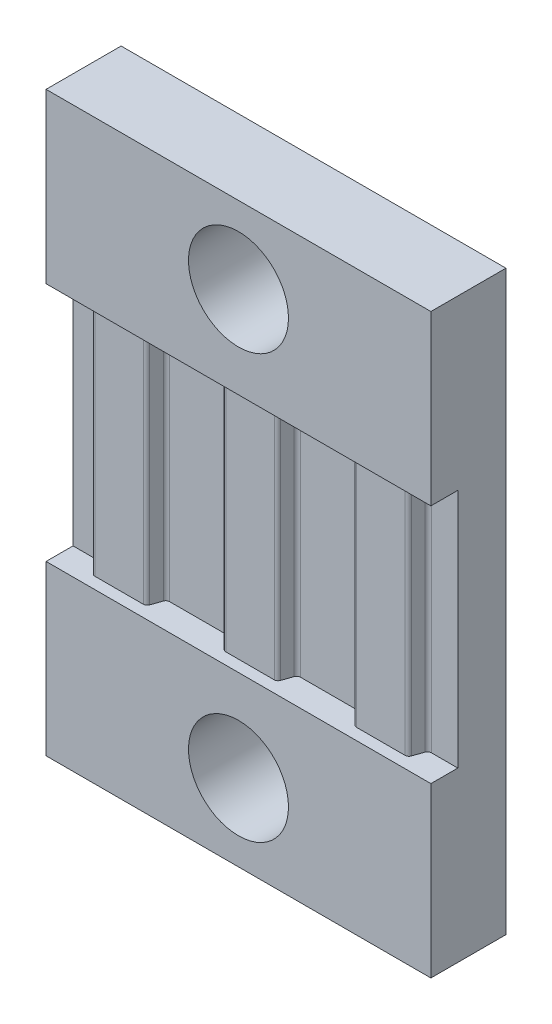
ISO-10303-21;
HEADER;
FILE_DESCRIPTION(('STEP AP214'),'2;1');
FILE_NAME('part.step','',(''),(''),'','','');
FILE_SCHEMA(('AUTOMOTIVE_DESIGN { 1 0 10303 214 1 1 1 1 }'));
ENDSEC;
DATA;
#1=APPLICATION_CONTEXT('core data for automotive mechanical design processes');
#2=APPLICATION_PROTOCOL_DEFINITION('international standard','automotive_design',2000,#1);
#3=PRODUCT_CONTEXT('',#1,'mechanical');
#4=PRODUCT('Part','Part','',(#3));
#5=PRODUCT_RELATED_PRODUCT_CATEGORY('part','',(#4));
#6=PRODUCT_DEFINITION_FORMATION('','',#4);
#7=PRODUCT_DEFINITION_CONTEXT('part definition',#1,'design');
#8=PRODUCT_DEFINITION('design','',#6,#7);
#9=PRODUCT_DEFINITION_SHAPE('','',#8);
#10=(LENGTH_UNIT() NAMED_UNIT(*) SI_UNIT(.MILLI.,.METRE.));
#11=(NAMED_UNIT(*) PLANE_ANGLE_UNIT() SI_UNIT($,.RADIAN.));
#12=(NAMED_UNIT(*) SI_UNIT($,.STERADIAN.) SOLID_ANGLE_UNIT());
#13=UNCERTAINTY_MEASURE_WITH_UNIT(LENGTH_MEASURE(1.E-05),#10,'distance_accuracy_value','');
#14=(GEOMETRIC_REPRESENTATION_CONTEXT(3) GLOBAL_UNCERTAINTY_ASSIGNED_CONTEXT((#13)) GLOBAL_UNIT_ASSIGNED_CONTEXT((#10,
#11,#12)) REPRESENTATION_CONTEXT('',''));
#15=CARTESIAN_POINT('',(0.,0.,0.));
#16=DIRECTION('',(0.,0.,1.));
#17=DIRECTION('',(1.,0.,0.));
#18=AXIS2_PLACEMENT_3D('',#15,#16,#17);
#19=CARTESIAN_POINT('',(0.,0.,1.5875));
#20=DIRECTION('',(0.,0.,-1.));
#21=DIRECTION('',(-1.,0.,0.));
#22=AXIS2_PLACEMENT_3D('',#19,#20,#21);
#23=PLANE('',#22);
#24=DIRECTION('',(0.,1.,0.));
#25=VECTOR('',#24,1.);
#26=CARTESIAN_POINT('',(5.4737,-9.527,1.5875));
#27=LINE('',#26,#25);
#28=CARTESIAN_POINT('',(5.4737,-3.96875,1.5875));
#29=VERTEX_POINT('',#28);
#30=CARTESIAN_POINT('',(5.4737,3.96875,1.5875));
#31=VERTEX_POINT('',#30);
#32=EDGE_CURVE('E338',#29,#31,#27,.T.);
#33=ORIENTED_EDGE('',*,*,#32,.F.);
#34=DIRECTION('',(-1.,0.,0.));
#35=VECTOR('',#34,1.);
#36=CARTESIAN_POINT('',(-6.35,-3.96875,1.5875));
#37=LINE('',#36,#35);
#38=CARTESIAN_POINT('',(6.35,-3.96875,1.5875));
#39=VERTEX_POINT('',#38);
#40=EDGE_CURVE('E446',#39,#29,#37,.T.);
#41=ORIENTED_EDGE('',*,*,#40,.F.);
#42=DIRECTION('',(0.,1.,0.));
#43=VECTOR('',#42,1.);
#44=CARTESIAN_POINT('',(6.35,-9.525,1.5875));
#45=LINE('',#44,#43);
#46=CARTESIAN_POINT('',(6.35,3.96875,1.5875));
#47=VERTEX_POINT('',#46);
#48=EDGE_CURVE('E469',#39,#47,#45,.T.);
#49=ORIENTED_EDGE('',*,*,#48,.T.);
#50=DIRECTION('',(1.,0.,0.));
#51=VECTOR('',#50,1.);
#52=CARTESIAN_POINT('',(-6.35,3.96875,1.5875));
#53=LINE('',#52,#51);
#54=EDGE_CURVE('E263',#31,#47,#53,.T.);
#55=ORIENTED_EDGE('',*,*,#54,.F.);
#56=EDGE_LOOP('',(#33,#41,#49,#55));
#57=FACE_BOUND('',#56,.T.);
#58=ADVANCED_FACE('F43',(#57),#23,.F.);
#59=CARTESIAN_POINT('',(-6.35,-3.96875,2.4765));
#60=DIRECTION('',(0.,-1.,0.));
#61=DIRECTION('',(0.,0.,-1.));
#62=AXIS2_PLACEMENT_3D('',#59,#60,#61);
#63=PLANE('',#62);
#64=CARTESIAN_POINT('',(-5.4737,-3.96875,1.7145));
#65=DIRECTION('',(0.,-1.,0.));
#66=DIRECTION('',(0.,0.,-1.));
#67=AXIS2_PLACEMENT_3D('',#64,#65,#66);
#68=CIRCLE('',#67,0.127);
#69=CARTESIAN_POINT('',(-5.35356486486486,-3.96875,1.67331081081081));
#70=VERTEX_POINT('',#69);
#71=CARTESIAN_POINT('',(-5.4737,-3.96875,1.5875));
#72=VERTEX_POINT('',#71);
#73=EDGE_CURVE('E296',#70,#72,#68,.F.);
#74=ORIENTED_EDGE('',*,*,#73,.T.);
#75=CARTESIAN_POINT('',(-6.35,-3.96875,1.5875));
#76=VERTEX_POINT('',#75);
#77=EDGE_CURVE('E460',#72,#76,#37,.T.);
#78=ORIENTED_EDGE('',*,*,#77,.T.);
#79=DIRECTION('',(0.,0.,-1.));
#80=VECTOR('',#79,1.);
#81=CARTESIAN_POINT('',(-6.35,-3.96875,2.4765));
#82=LINE('',#81,#80);
#83=CARTESIAN_POINT('',(-6.35,-3.96875,2.4765));
#84=VERTEX_POINT('',#83);
#85=EDGE_CURVE('E442',#84,#76,#82,.T.);
#86=ORIENTED_EDGE('',*,*,#85,.F.);
#87=DIRECTION('',(-1.,0.,0.));
#88=VECTOR('',#87,1.);
#89=CARTESIAN_POINT('',(-6.35,-3.96875,2.4765));
#90=LINE('',#89,#88);
#91=CARTESIAN_POINT('',(6.35,-3.96875,2.4765));
#92=VERTEX_POINT('',#91);
#93=EDGE_CURVE('E445',#92,#84,#90,.T.);
#94=ORIENTED_EDGE('',*,*,#93,.F.);
#95=DIRECTION('',(0.,0.,-1.));
#96=VECTOR('',#95,1.);
#97=CARTESIAN_POINT('',(6.35,-3.96875,2.4765));
#98=LINE('',#97,#96);
#99=EDGE_CURVE('E362',#92,#39,#98,.T.);
#100=ORIENTED_EDGE('',*,*,#99,.T.);
#101=ORIENTED_EDGE('',*,*,#40,.T.);
#102=CARTESIAN_POINT('',(5.4737,-3.96875,1.7145));
#103=DIRECTION('',(0.,-1.,0.));
#104=DIRECTION('',(0.,0.,-1.));
#105=AXIS2_PLACEMENT_3D('',#102,#103,#104);
#106=CIRCLE('',#105,0.127);
#107=CARTESIAN_POINT('',(5.35356486486486,-3.96875,1.67331081081081));
#108=VERTEX_POINT('',#107);
#109=EDGE_CURVE('E355',#29,#108,#106,.F.);
#110=ORIENTED_EDGE('',*,*,#109,.T.);
#111=DIRECTION('',(-0.324324324324325,0.,0.945945945945946));
#112=VECTOR('',#111,1.);
#113=CARTESIAN_POINT('',(5.23823513513513,-3.96875,2.00968918918919));
#114=LINE('',#113,#112);
#115=CARTESIAN_POINT('',(5.23823513513513,-3.96875,2.00968918918919));
#116=VERTEX_POINT('',#115);
#117=EDGE_CURVE('E357',#108,#116,#114,.T.);
#118=ORIENTED_EDGE('',*,*,#117,.T.);
#119=CARTESIAN_POINT('',(5.1181,-3.96875,1.9685));
#120=DIRECTION('',(0.,-1.,0.));
#121=DIRECTION('',(0.,0.,-1.));
#122=AXIS2_PLACEMENT_3D('',#119,#120,#121);
#123=CIRCLE('',#122,0.127);
#124=CARTESIAN_POINT('',(5.1181,-3.96875,2.0955));
#125=VERTEX_POINT('',#124);
#126=EDGE_CURVE('E327',#116,#125,#123,.T.);
#127=ORIENTED_EDGE('',*,*,#126,.T.);
#128=DIRECTION('',(-1.,0.,0.));
#129=VECTOR('',#128,1.);
#130=CARTESIAN_POINT('',(3.5179,-3.96875,2.0955));
#131=LINE('',#130,#129);
#132=CARTESIAN_POINT('',(3.5179,-3.96875,2.0955));
#133=VERTEX_POINT('',#132);
#134=EDGE_CURVE('E347',#125,#133,#131,.T.);
#135=ORIENTED_EDGE('',*,*,#134,.T.);
#136=CARTESIAN_POINT('',(3.5179,-3.96875,1.9685));
#137=DIRECTION('',(0.,-1.,0.));
#138=DIRECTION('',(0.,0.,-1.));
#139=AXIS2_PLACEMENT_3D('',#136,#137,#138);
#140=CIRCLE('',#139,0.127);
#141=CARTESIAN_POINT('',(3.39776486486487,-3.96875,2.00968918918919));
#142=VERTEX_POINT('',#141);
#143=EDGE_CURVE('E349',#133,#142,#140,.T.);
#144=ORIENTED_EDGE('',*,*,#143,.T.);
#145=DIRECTION('',(-0.324324324324325,0.,-0.945945945945946));
#146=VECTOR('',#145,1.);
#147=CARTESIAN_POINT('',(3.39776486486486,-3.96875,2.00968918918919));
#148=LINE('',#147,#146);
#149=CARTESIAN_POINT('',(3.28243513513513,-3.96875,1.67331081081081));
#150=VERTEX_POINT('',#149);
#151=EDGE_CURVE('E351',#142,#150,#148,.T.);
#152=ORIENTED_EDGE('',*,*,#151,.T.);
#153=CARTESIAN_POINT('',(3.1623,-3.96875,1.7145));
#154=DIRECTION('',(0.,-1.,0.));
#155=DIRECTION('',(0.,0.,-1.));
#156=AXIS2_PLACEMENT_3D('',#153,#154,#155);
#157=CIRCLE('',#156,0.127);
#158=CARTESIAN_POINT('',(3.1623,-3.96875,1.5875));
#159=VERTEX_POINT('',#158);
#160=EDGE_CURVE('E353',#150,#159,#157,.F.);
#161=ORIENTED_EDGE('',*,*,#160,.T.);
#162=CARTESIAN_POINT('',(1.1557,-3.96875,1.5875));
#163=VERTEX_POINT('',#162);
#164=EDGE_CURVE('E449',#159,#163,#37,.T.);
#165=ORIENTED_EDGE('',*,*,#164,.T.);
#166=CARTESIAN_POINT('',(1.1557,-3.96875,1.7145));
#167=DIRECTION('',(0.,-1.,0.));
#168=DIRECTION('',(0.,0.,-1.));
#169=AXIS2_PLACEMENT_3D('',#166,#167,#168);
#170=CIRCLE('',#169,0.127);
#171=CARTESIAN_POINT('',(1.03556486486486,-3.96875,1.67331081081081));
#172=VERTEX_POINT('',#171);
#173=EDGE_CURVE('E412',#163,#172,#170,.F.);
#174=ORIENTED_EDGE('',*,*,#173,.T.);
#175=DIRECTION('',(-0.324324324324325,0.,0.945945945945946));
#176=VECTOR('',#175,1.);
#177=CARTESIAN_POINT('',(0.920235135135135,-3.96875,2.00968918918919));
#178=LINE('',#177,#176);
#179=CARTESIAN_POINT('',(0.920235135135134,-3.96875,2.00968918918919));
#180=VERTEX_POINT('',#179);
#181=EDGE_CURVE('E414',#172,#180,#178,.T.);
#182=ORIENTED_EDGE('',*,*,#181,.T.);
#183=CARTESIAN_POINT('',(0.8001,-3.96875,1.9685));
#184=DIRECTION('',(0.,-1.,0.));
#185=DIRECTION('',(0.,0.,-1.));
#186=AXIS2_PLACEMENT_3D('',#183,#184,#185);
#187=CIRCLE('',#186,0.127);
#188=CARTESIAN_POINT('',(0.8001,-3.96875,2.0955));
#189=VERTEX_POINT('',#188);
#190=EDGE_CURVE('E402',#180,#189,#187,.T.);
#191=ORIENTED_EDGE('',*,*,#190,.T.);
#192=DIRECTION('',(-1.,0.,0.));
#193=VECTOR('',#192,1.);
#194=CARTESIAN_POINT('',(-0.8001,-3.96875,2.0955));
#195=LINE('',#194,#193);
#196=CARTESIAN_POINT('',(-0.800100000000001,-3.96875,2.0955));
#197=VERTEX_POINT('',#196);
#198=EDGE_CURVE('E404',#189,#197,#195,.T.);
#199=ORIENTED_EDGE('',*,*,#198,.T.);
#200=CARTESIAN_POINT('',(-0.8001,-3.96875,1.9685));
#201=DIRECTION('',(0.,-1.,0.));
#202=DIRECTION('',(0.,0.,-1.));
#203=AXIS2_PLACEMENT_3D('',#200,#201,#202);
#204=CIRCLE('',#203,0.127);
#205=CARTESIAN_POINT('',(-0.920235135135135,-3.96875,2.00968918918919));
#206=VERTEX_POINT('',#205);
#207=EDGE_CURVE('E406',#197,#206,#204,.T.);
#208=ORIENTED_EDGE('',*,*,#207,.T.);
#209=DIRECTION('',(-0.324324324324325,0.,-0.945945945945946));
#210=VECTOR('',#209,1.);
#211=CARTESIAN_POINT('',(-0.920235135135135,-3.96875,2.00968918918919));
#212=LINE('',#211,#210);
#213=CARTESIAN_POINT('',(-1.03556486486486,-3.96875,1.67331081081081));
#214=VERTEX_POINT('',#213);
#215=EDGE_CURVE('E408',#206,#214,#212,.T.);
#216=ORIENTED_EDGE('',*,*,#215,.T.);
#217=CARTESIAN_POINT('',(-1.1557,-3.96875,1.7145));
#218=DIRECTION('',(0.,-1.,0.));
#219=DIRECTION('',(0.,0.,-1.));
#220=AXIS2_PLACEMENT_3D('',#217,#218,#219);
#221=CIRCLE('',#220,0.127);
#222=CARTESIAN_POINT('',(-1.1557,-3.96875,1.5875));
#223=VERTEX_POINT('',#222);
#224=EDGE_CURVE('E410',#214,#223,#221,.F.);
#225=ORIENTED_EDGE('',*,*,#224,.T.);
#226=CARTESIAN_POINT('',(-3.1623,-3.96875,1.5875));
#227=VERTEX_POINT('',#226);
#228=EDGE_CURVE('E450',#223,#227,#37,.T.);
#229=ORIENTED_EDGE('',*,*,#228,.T.);
#230=CARTESIAN_POINT('',(-3.1623,-3.96875,1.7145));
#231=DIRECTION('',(0.,-1.,0.));
#232=DIRECTION('',(0.,0.,-1.));
#233=AXIS2_PLACEMENT_3D('',#230,#231,#232);
#234=CIRCLE('',#233,0.127);
#235=CARTESIAN_POINT('',(-3.28243513513514,-3.96875,1.67331081081081));
#236=VERTEX_POINT('',#235);
#237=EDGE_CURVE('E276',#227,#236,#234,.F.);
#238=ORIENTED_EDGE('',*,*,#237,.T.);
#239=DIRECTION('',(-0.324324324324325,0.,0.945945945945946));
#240=VECTOR('',#239,1.);
#241=CARTESIAN_POINT('',(-3.39776486486486,-3.96875,2.00968918918919));
#242=LINE('',#241,#240);
#243=CARTESIAN_POINT('',(-3.39776486486487,-3.96875,2.00968918918919));
#244=VERTEX_POINT('',#243);
#245=EDGE_CURVE('E299',#236,#244,#242,.T.);
#246=ORIENTED_EDGE('',*,*,#245,.T.);
#247=CARTESIAN_POINT('',(-3.5179,-3.96875,1.9685));
#248=DIRECTION('',(0.,-1.,0.));
#249=DIRECTION('',(0.,0.,-1.));
#250=AXIS2_PLACEMENT_3D('',#247,#248,#249);
#251=CIRCLE('',#250,0.127);
#252=CARTESIAN_POINT('',(-3.5179,-3.96875,2.0955));
#253=VERTEX_POINT('',#252);
#254=EDGE_CURVE('E289',#244,#253,#251,.T.);
#255=ORIENTED_EDGE('',*,*,#254,.T.);
#256=DIRECTION('',(-1.,0.,0.));
#257=VECTOR('',#256,1.);
#258=CARTESIAN_POINT('',(-5.1181,-3.96875,2.0955));
#259=LINE('',#258,#257);
#260=CARTESIAN_POINT('',(-5.1181,-3.96875,2.0955));
#261=VERTEX_POINT('',#260);
#262=EDGE_CURVE('E292',#253,#261,#259,.T.);
#263=ORIENTED_EDGE('',*,*,#262,.T.);
#264=CARTESIAN_POINT('',(-5.1181,-3.96875,1.9685));
#265=DIRECTION('',(0.,-1.,0.));
#266=DIRECTION('',(0.,0.,-1.));
#267=AXIS2_PLACEMENT_3D('',#264,#265,#266);
#268=CIRCLE('',#267,0.127);
#269=CARTESIAN_POINT('',(-5.23823513513513,-3.96875,2.00968918918919));
#270=VERTEX_POINT('',#269);
#271=EDGE_CURVE('E63',#261,#270,#268,.T.);
#272=ORIENTED_EDGE('',*,*,#271,.T.);
#273=DIRECTION('',(-0.324324324324325,0.,-0.945945945945946));
#274=VECTOR('',#273,1.);
#275=CARTESIAN_POINT('',(-5.23823513513513,-3.96875,2.00968918918919));
#276=LINE('',#275,#274);
#277=EDGE_CURVE('E58',#270,#70,#276,.T.);
#278=ORIENTED_EDGE('',*,*,#277,.T.);
#279=EDGE_LOOP('',(#74,#78,#86,#94,#100,#101,#110,#118,#127,#135,#144,#152,#161,#165,#174,#182,
#191,#199,#208,#216,#225,#229,#238,#246,#255,#263,#272,#278));
#280=FACE_BOUND('',#279,.T.);
#281=ADVANCED_FACE('F515',(#280),#63,.F.);
#282=CARTESIAN_POINT('',(-6.35,3.96875,2.4765));
#283=DIRECTION('',(0.,1.,0.));
#284=DIRECTION('',(0.,0.,1.));
#285=AXIS2_PLACEMENT_3D('',#282,#283,#284);
#286=PLANE('',#285);
#287=CARTESIAN_POINT('',(-5.4737,3.96875,1.7145));
#288=DIRECTION('',(0.,1.,0.));
#289=DIRECTION('',(0.,0.,-1.));
#290=AXIS2_PLACEMENT_3D('',#287,#288,#289);
#291=CIRCLE('',#290,0.127);
#292=CARTESIAN_POINT('',(-5.35356486486486,3.96875,1.67331081081081));
#293=VERTEX_POINT('',#292);
#294=CARTESIAN_POINT('',(-5.4737,3.96875,1.5875));
#295=VERTEX_POINT('',#294);
#296=EDGE_CURVE('E272',#293,#295,#291,.T.);
#297=ORIENTED_EDGE('',*,*,#296,.F.);
#298=DIRECTION('',(-0.324324324324325,0.,-0.945945945945946));
#299=VECTOR('',#298,1.);
#300=CARTESIAN_POINT('',(-5.23823513513513,3.96875,2.00968918918919));
#301=LINE('',#300,#299);
#302=CARTESIAN_POINT('',(-5.23823513513513,3.96875,2.00968918918919));
#303=VERTEX_POINT('',#302);
#304=EDGE_CURVE('E526',#303,#293,#301,.T.);
#305=ORIENTED_EDGE('',*,*,#304,.F.);
#306=CARTESIAN_POINT('',(-5.1181,3.96875,1.9685));
#307=DIRECTION('',(0.,-1.,0.));
#308=DIRECTION('',(0.,0.,-1.));
#309=AXIS2_PLACEMENT_3D('',#306,#307,#308);
#310=CIRCLE('',#309,0.127);
#311=CARTESIAN_POINT('',(-5.1181,3.96875,2.0955));
#312=VERTEX_POINT('',#311);
#313=EDGE_CURVE('E528',#312,#303,#310,.T.);
#314=ORIENTED_EDGE('',*,*,#313,.F.);
#315=DIRECTION('',(-1.,0.,0.));
#316=VECTOR('',#315,1.);
#317=CARTESIAN_POINT('',(-5.1181,3.96875,2.0955));
#318=LINE('',#317,#316);
#319=CARTESIAN_POINT('',(-3.5179,3.96875,2.0955));
#320=VERTEX_POINT('',#319);
#321=EDGE_CURVE('E288',#320,#312,#318,.T.);
#322=ORIENTED_EDGE('',*,*,#321,.F.);
#323=CARTESIAN_POINT('',(-3.5179,3.96875,1.9685));
#324=DIRECTION('',(0.,-1.,0.));
#325=DIRECTION('',(0.,0.,1.));
#326=AXIS2_PLACEMENT_3D('',#323,#324,#325);
#327=CIRCLE('',#326,0.127);
#328=CARTESIAN_POINT('',(-3.39776486486487,3.96875,2.00968918918919));
#329=VERTEX_POINT('',#328);
#330=EDGE_CURVE('E416',#329,#320,#327,.T.);
#331=ORIENTED_EDGE('',*,*,#330,.F.);
#332=DIRECTION('',(-0.324324324324325,0.,0.945945945945946));
#333=VECTOR('',#332,1.);
#334=CARTESIAN_POINT('',(-3.39776486486486,3.96875,2.00968918918919));
#335=LINE('',#334,#333);
#336=CARTESIAN_POINT('',(-3.28243513513514,3.96875,1.67331081081081));
#337=VERTEX_POINT('',#336);
#338=EDGE_CURVE('E268',#337,#329,#335,.T.);
#339=ORIENTED_EDGE('',*,*,#338,.F.);
#340=CARTESIAN_POINT('',(-3.1623,3.96875,1.7145));
#341=DIRECTION('',(0.,1.,0.));
#342=DIRECTION('',(0.,0.,1.));
#343=AXIS2_PLACEMENT_3D('',#340,#341,#342);
#344=CIRCLE('',#343,0.127);
#345=CARTESIAN_POINT('',(-3.1623,3.96875,1.5875));
#346=VERTEX_POINT('',#345);
#347=EDGE_CURVE('E265',#346,#337,#344,.T.);
#348=ORIENTED_EDGE('',*,*,#347,.F.);
#349=CARTESIAN_POINT('',(-1.1557,3.96875,1.5875));
#350=VERTEX_POINT('',#349);
#351=EDGE_CURVE('E249',#346,#350,#53,.T.);
#352=ORIENTED_EDGE('',*,*,#351,.T.);
#353=CARTESIAN_POINT('',(-1.1557,3.96875,1.7145));
#354=DIRECTION('',(0.,1.,0.));
#355=DIRECTION('',(0.,0.,-1.));
#356=AXIS2_PLACEMENT_3D('',#353,#354,#355);
#357=CIRCLE('',#356,0.127);
#358=CARTESIAN_POINT('',(-1.03556486486486,3.96875,1.67331081081081));
#359=VERTEX_POINT('',#358);
#360=EDGE_CURVE('E367',#359,#350,#357,.T.);
#361=ORIENTED_EDGE('',*,*,#360,.F.);
#362=DIRECTION('',(-0.324324324324325,0.,-0.945945945945946));
#363=VECTOR('',#362,1.);
#364=CARTESIAN_POINT('',(-0.920235135135135,3.96875,2.00968918918919));
#365=LINE('',#364,#363);
#366=CARTESIAN_POINT('',(-0.920235135135135,3.96875,2.00968918918919));
#367=VERTEX_POINT('',#366);
#368=EDGE_CURVE('E369',#367,#359,#365,.T.);
#369=ORIENTED_EDGE('',*,*,#368,.F.);
#370=CARTESIAN_POINT('',(-0.8001,3.96875,1.9685));
#371=DIRECTION('',(0.,-1.,0.));
#372=DIRECTION('',(0.,0.,-1.));
#373=AXIS2_PLACEMENT_3D('',#370,#371,#372);
#374=CIRCLE('',#373,0.127);
#375=CARTESIAN_POINT('',(-0.800100000000001,3.96875,2.0955));
#376=VERTEX_POINT('',#375);
#377=EDGE_CURVE('E373',#376,#367,#374,.T.);
#378=ORIENTED_EDGE('',*,*,#377,.F.);
#379=DIRECTION('',(-1.,0.,0.));
#380=VECTOR('',#379,1.);
#381=CARTESIAN_POINT('',(-0.8001,3.96875,2.0955));
#382=LINE('',#381,#380);
#383=CARTESIAN_POINT('',(0.8001,3.96875,2.0955));
#384=VERTEX_POINT('',#383);
#385=EDGE_CURVE('E370',#384,#376,#382,.T.);
#386=ORIENTED_EDGE('',*,*,#385,.F.);
#387=CARTESIAN_POINT('',(0.8001,3.96875,1.9685));
#388=DIRECTION('',(0.,-1.,0.));
#389=DIRECTION('',(0.,0.,1.));
#390=AXIS2_PLACEMENT_3D('',#387,#388,#389);
#391=CIRCLE('',#390,0.127);
#392=CARTESIAN_POINT('',(0.920235135135134,3.96875,2.00968918918919));
#393=VERTEX_POINT('',#392);
#394=EDGE_CURVE('E359',#393,#384,#391,.T.);
#395=ORIENTED_EDGE('',*,*,#394,.F.);
#396=DIRECTION('',(-0.324324324324325,0.,0.945945945945946));
#397=VECTOR('',#396,1.);
#398=CARTESIAN_POINT('',(0.920235135135135,3.96875,2.00968918918919));
#399=LINE('',#398,#397);
#400=CARTESIAN_POINT('',(1.03556486486486,3.96875,1.67331081081081));
#401=VERTEX_POINT('',#400);
#402=EDGE_CURVE('E363',#401,#393,#399,.T.);
#403=ORIENTED_EDGE('',*,*,#402,.F.);
#404=CARTESIAN_POINT('',(1.1557,3.96875,1.7145));
#405=DIRECTION('',(0.,1.,0.));
#406=DIRECTION('',(0.,0.,1.));
#407=AXIS2_PLACEMENT_3D('',#404,#405,#406);
#408=CIRCLE('',#407,0.127);
#409=CARTESIAN_POINT('',(1.1557,3.96875,1.5875));
#410=VERTEX_POINT('',#409);
#411=EDGE_CURVE('E366',#410,#401,#408,.T.);
#412=ORIENTED_EDGE('',*,*,#411,.F.);
#413=CARTESIAN_POINT('',(3.1623,3.96875,1.5875));
#414=VERTEX_POINT('',#413);
#415=EDGE_CURVE('E261',#410,#414,#53,.T.);
#416=ORIENTED_EDGE('',*,*,#415,.T.);
#417=CARTESIAN_POINT('',(3.1623,3.96875,1.7145));
#418=DIRECTION('',(0.,1.,0.));
#419=DIRECTION('',(0.,0.,-1.));
#420=AXIS2_PLACEMENT_3D('',#417,#418,#419);
#421=CIRCLE('',#420,0.127);
#422=CARTESIAN_POINT('',(3.28243513513513,3.96875,1.67331081081081));
#423=VERTEX_POINT('',#422);
#424=EDGE_CURVE('E308',#423,#414,#421,.T.);
#425=ORIENTED_EDGE('',*,*,#424,.F.);
#426=DIRECTION('',(-0.324324324324325,0.,-0.945945945945946));
#427=VECTOR('',#426,1.);
#428=CARTESIAN_POINT('',(3.39776486486486,3.96875,2.00968918918919));
#429=LINE('',#428,#427);
#430=CARTESIAN_POINT('',(3.39776486486487,3.96875,2.00968918918919));
#431=VERTEX_POINT('',#430);
#432=EDGE_CURVE('E311',#431,#423,#429,.T.);
#433=ORIENTED_EDGE('',*,*,#432,.F.);
#434=CARTESIAN_POINT('',(3.5179,3.96875,1.9685));
#435=DIRECTION('',(0.,-1.,0.));
#436=DIRECTION('',(0.,0.,-1.));
#437=AXIS2_PLACEMENT_3D('',#434,#435,#436);
#438=CIRCLE('',#437,0.127);
#439=CARTESIAN_POINT('',(3.5179,3.96875,2.0955));
#440=VERTEX_POINT('',#439);
#441=EDGE_CURVE('E315',#440,#431,#438,.T.);
#442=ORIENTED_EDGE('',*,*,#441,.F.);
#443=DIRECTION('',(-1.,0.,0.));
#444=VECTOR('',#443,1.);
#445=CARTESIAN_POINT('',(3.5179,3.96875,2.0955));
#446=LINE('',#445,#444);
#447=CARTESIAN_POINT('',(5.1181,3.96875,2.0955));
#448=VERTEX_POINT('',#447);
#449=EDGE_CURVE('E312',#448,#440,#446,.T.);
#450=ORIENTED_EDGE('',*,*,#449,.F.);
#451=CARTESIAN_POINT('',(5.1181,3.96875,1.9685));
#452=DIRECTION('',(0.,-1.,0.));
#453=DIRECTION('',(0.,0.,1.));
#454=AXIS2_PLACEMENT_3D('',#451,#452,#453);
#455=CIRCLE('',#454,0.127);
#456=CARTESIAN_POINT('',(5.23823513513513,3.96875,2.00968918918919));
#457=VERTEX_POINT('',#456);
#458=EDGE_CURVE('E301',#457,#448,#455,.T.);
#459=ORIENTED_EDGE('',*,*,#458,.F.);
#460=DIRECTION('',(-0.324324324324325,0.,0.945945945945946));
#461=VECTOR('',#460,1.);
#462=CARTESIAN_POINT('',(5.23823513513513,3.96875,2.00968918918919));
#463=LINE('',#462,#461);
#464=CARTESIAN_POINT('',(5.35356486486486,3.96875,1.67331081081081));
#465=VERTEX_POINT('',#464);
#466=EDGE_CURVE('E304',#465,#457,#463,.T.);
#467=ORIENTED_EDGE('',*,*,#466,.F.);
#468=CARTESIAN_POINT('',(5.4737,3.96875,1.7145));
#469=DIRECTION('',(0.,1.,0.));
#470=DIRECTION('',(0.,0.,1.));
#471=AXIS2_PLACEMENT_3D('',#468,#469,#470);
#472=CIRCLE('',#471,0.127);
#473=EDGE_CURVE('E307',#31,#465,#472,.T.);
#474=ORIENTED_EDGE('',*,*,#473,.F.);
#475=ORIENTED_EDGE('',*,*,#54,.T.);
#476=DIRECTION('',(0.,0.,-1.));
#477=VECTOR('',#476,1.);
#478=CARTESIAN_POINT('',(6.35,3.96875,2.4765));
#479=LINE('',#478,#477);
#480=CARTESIAN_POINT('',(6.35,3.96875,2.4765));
#481=VERTEX_POINT('',#480);
#482=EDGE_CURVE('E431',#481,#47,#479,.T.);
#483=ORIENTED_EDGE('',*,*,#482,.F.);
#484=DIRECTION('',(1.,0.,0.));
#485=VECTOR('',#484,1.);
#486=CARTESIAN_POINT('',(-6.35,3.96875,2.4765));
#487=LINE('',#486,#485);
#488=CARTESIAN_POINT('',(-6.35,3.96875,2.4765));
#489=VERTEX_POINT('',#488);
#490=EDGE_CURVE('E424',#489,#481,#487,.T.);
#491=ORIENTED_EDGE('',*,*,#490,.F.);
#492=DIRECTION('',(0.,0.,-1.));
#493=VECTOR('',#492,1.);
#494=CARTESIAN_POINT('',(-6.35,3.96875,2.4765));
#495=LINE('',#494,#493);
#496=CARTESIAN_POINT('',(-6.35,3.96875,1.5875));
#497=VERTEX_POINT('',#496);
#498=EDGE_CURVE('E436',#489,#497,#495,.T.);
#499=ORIENTED_EDGE('',*,*,#498,.T.);
#500=EDGE_CURVE('E260',#497,#295,#53,.T.);
#501=ORIENTED_EDGE('',*,*,#500,.T.);
#502=EDGE_LOOP('',(#297,#305,#314,#322,#331,#339,#348,#352,#361,#369,#378,#386,#395,#403,#412,
#416,#425,#433,#442,#450,#459,#467,#474,#475,#483,#491,#499,#501));
#503=FACE_BOUND('',#502,.T.);
#504=ADVANCED_FACE('F266',(#503),#286,.F.);
#505=DIRECTION('',(0.,1.,0.));
#506=VECTOR('',#505,1.);
#507=CARTESIAN_POINT('',(-3.1623,-9.527,1.5875));
#508=LINE('',#507,#506);
#509=EDGE_CURVE('E254',#227,#346,#508,.T.);
#510=ORIENTED_EDGE('',*,*,#509,.F.);
#511=ORIENTED_EDGE('',*,*,#228,.F.);
#512=DIRECTION('',(0.,1.,0.));
#513=VECTOR('',#512,1.);
#514=CARTESIAN_POINT('',(-1.1557,-9.527,1.5875));
#515=LINE('',#514,#513);
#516=EDGE_CURVE('E257',#223,#350,#515,.T.);
#517=ORIENTED_EDGE('',*,*,#516,.T.);
#518=ORIENTED_EDGE('',*,*,#351,.F.);
#519=EDGE_LOOP('',(#510,#511,#517,#518));
#520=FACE_BOUND('',#519,.T.);
#521=ADVANCED_FACE('F251',(#520),#23,.F.);
#522=ORIENTED_EDGE('',*,*,#164,.F.);
#523=DIRECTION('',(0.,1.,0.));
#524=VECTOR('',#523,1.);
#525=CARTESIAN_POINT('',(3.1623,-9.527,1.5875));
#526=LINE('',#525,#524);
#527=EDGE_CURVE('E336',#159,#414,#526,.T.);
#528=ORIENTED_EDGE('',*,*,#527,.T.);
#529=ORIENTED_EDGE('',*,*,#415,.F.);
#530=DIRECTION('',(0.,1.,0.));
#531=VECTOR('',#530,1.);
#532=CARTESIAN_POINT('',(1.1557,-9.527,1.5875));
#533=LINE('',#532,#531);
#534=EDGE_CURVE('E386',#163,#410,#533,.T.);
#535=ORIENTED_EDGE('',*,*,#534,.F.);
#536=EDGE_LOOP('',(#522,#528,#529,#535));
#537=FACE_BOUND('',#536,.T.);
#538=ADVANCED_FACE('F571',(#537),#23,.F.);
#539=ORIENTED_EDGE('',*,*,#77,.F.);
#540=DIRECTION('',(0.,1.,0.));
#541=VECTOR('',#540,1.);
#542=CARTESIAN_POINT('',(-5.4737,-9.527,1.5875));
#543=LINE('',#542,#541);
#544=EDGE_CURVE('E278',#72,#295,#543,.T.);
#545=ORIENTED_EDGE('',*,*,#544,.T.);
#546=ORIENTED_EDGE('',*,*,#500,.F.);
#547=DIRECTION('',(0.,-1.,0.));
#548=VECTOR('',#547,1.);
#549=CARTESIAN_POINT('',(-6.35,-9.525,1.5875));
#550=LINE('',#549,#548);
#551=EDGE_CURVE('E472',#497,#76,#550,.T.);
#552=ORIENTED_EDGE('',*,*,#551,.T.);
#553=EDGE_LOOP('',(#539,#545,#546,#552));
#554=FACE_BOUND('',#553,.T.);
#555=ADVANCED_FACE('F519',(#554),#23,.F.);
#556=CARTESIAN_POINT('',(0.,0.,0.));
#557=DIRECTION('',(0.,0.,-1.));
#558=DIRECTION('',(-1.,0.,0.));
#559=AXIS2_PLACEMENT_3D('',#556,#557,#558);
#560=PLANE('',#559);
#561=CARTESIAN_POINT('',(0.,6.985,0.));
#562=DIRECTION('',(0.,0.,1.));
#563=DIRECTION('',(1.,0.,0.));
#564=AXIS2_PLACEMENT_3D('',#561,#562,#563);
#565=CIRCLE('',#564,1.65);
#566=CARTESIAN_POINT('',(1.65,6.985,0.));
#567=VERTEX_POINT('',#566);
#568=EDGE_CURVE('E465',#567,#567,#565,.T.);
#569=ORIENTED_EDGE('',*,*,#568,.T.);
#570=EDGE_LOOP('',(#569));
#571=FACE_BOUND('',#570,.T.);
#572=DIRECTION('',(0.,1.,0.));
#573=VECTOR('',#572,1.);
#574=CARTESIAN_POINT('',(6.35,-9.525,0.));
#575=LINE('',#574,#573);
#576=CARTESIAN_POINT('',(6.35,-9.525,0.));
#577=VERTEX_POINT('',#576);
#578=CARTESIAN_POINT('',(6.35,9.525,0.));
#579=VERTEX_POINT('',#578);
#580=EDGE_CURVE('E468',#577,#579,#575,.T.);
#581=ORIENTED_EDGE('',*,*,#580,.F.);
#582=DIRECTION('',(1.,0.,0.));
#583=VECTOR('',#582,1.);
#584=CARTESIAN_POINT('',(-6.35,-9.525,0.));
#585=LINE('',#584,#583);
#586=CARTESIAN_POINT('',(-6.35,-9.525,0.));
#587=VERTEX_POINT('',#586);
#588=EDGE_CURVE('E473',#587,#577,#585,.T.);
#589=ORIENTED_EDGE('',*,*,#588,.F.);
#590=DIRECTION('',(0.,-1.,0.));
#591=VECTOR('',#590,1.);
#592=CARTESIAN_POINT('',(-6.35,-9.525,0.));
#593=LINE('',#592,#591);
#594=CARTESIAN_POINT('',(-6.35,9.525,0.));
#595=VERTEX_POINT('',#594);
#596=EDGE_CURVE('E481',#595,#587,#593,.T.);
#597=ORIENTED_EDGE('',*,*,#596,.F.);
#598=DIRECTION('',(-1.,0.,0.));
#599=VECTOR('',#598,1.);
#600=CARTESIAN_POINT('',(-6.35,9.525,0.));
#601=LINE('',#600,#599);
#602=EDGE_CURVE('E479',#579,#595,#601,.T.);
#603=ORIENTED_EDGE('',*,*,#602,.F.);
#604=EDGE_LOOP('',(#581,#589,#597,#603));
#605=FACE_BOUND('',#604,.T.);
#606=CARTESIAN_POINT('',(0.,-6.985,0.));
#607=DIRECTION('',(0.,0.,1.));
#608=DIRECTION('',(-1.,0.,0.));
#609=AXIS2_PLACEMENT_3D('',#606,#607,#608);
#610=CIRCLE('',#609,1.65);
#611=CARTESIAN_POINT('',(-1.65,-6.985,0.));
#612=VERTEX_POINT('',#611);
#613=EDGE_CURVE('E439',#612,#612,#610,.T.);
#614=ORIENTED_EDGE('',*,*,#613,.T.);
#615=EDGE_LOOP('',(#614));
#616=FACE_BOUND('',#615,.T.);
#617=ADVANCED_FACE('F499',(#571,#605,#616),#560,.T.);
#618=CARTESIAN_POINT('',(6.35,-9.525,1.5875));
#619=DIRECTION('',(-1.,0.,0.));
#620=DIRECTION('',(0.,0.,1.));
#621=AXIS2_PLACEMENT_3D('',#618,#619,#620);
#622=PLANE('',#621);
#623=ORIENTED_EDGE('',*,*,#580,.T.);
#624=DIRECTION('',(0.,0.,-1.));
#625=VECTOR('',#624,1.);
#626=CARTESIAN_POINT('',(6.35,9.525,1.5875));
#627=LINE('',#626,#625);
#628=CARTESIAN_POINT('',(6.35,9.525,2.4765));
#629=VERTEX_POINT('',#628);
#630=EDGE_CURVE('E11',#629,#579,#627,.T.);
#631=ORIENTED_EDGE('',*,*,#630,.F.);
#632=DIRECTION('',(0.,1.,0.));
#633=VECTOR('',#632,1.);
#634=CARTESIAN_POINT('',(6.35,9.525,2.4765));
#635=LINE('',#634,#633);
#636=EDGE_CURVE('E426',#481,#629,#635,.T.);
#637=ORIENTED_EDGE('',*,*,#636,.F.);
#638=ORIENTED_EDGE('',*,*,#482,.T.);
#639=ORIENTED_EDGE('',*,*,#48,.F.);
#640=ORIENTED_EDGE('',*,*,#99,.F.);
#641=DIRECTION('',(0.,1.,0.));
#642=VECTOR('',#641,1.);
#643=CARTESIAN_POINT('',(6.35,-9.525,2.4765));
#644=LINE('',#643,#642);
#645=CARTESIAN_POINT('',(6.35,-9.525,2.4765));
#646=VERTEX_POINT('',#645);
#647=EDGE_CURVE('E452',#646,#92,#644,.T.);
#648=ORIENTED_EDGE('',*,*,#647,.F.);
#649=DIRECTION('',(0.,0.,-1.));
#650=VECTOR('',#649,1.);
#651=CARTESIAN_POINT('',(6.35,-9.525,1.5875));
#652=LINE('',#651,#650);
#653=EDGE_CURVE('E476',#646,#577,#652,.T.);
#654=ORIENTED_EDGE('',*,*,#653,.T.);
#655=EDGE_LOOP('',(#623,#631,#637,#638,#639,#640,#648,#654));
#656=FACE_BOUND('',#655,.T.);
#657=ADVANCED_FACE('F45',(#656),#622,.F.);
#658=CARTESIAN_POINT('',(-6.35,9.525,1.5875));
#659=DIRECTION('',(0.,-1.,0.));
#660=DIRECTION('',(0.,0.,-1.));
#661=AXIS2_PLACEMENT_3D('',#658,#659,#660);
#662=PLANE('',#661);
#663=ORIENTED_EDGE('',*,*,#602,.T.);
#664=DIRECTION('',(0.,0.,-1.));
#665=VECTOR('',#664,1.);
#666=CARTESIAN_POINT('',(-6.35,9.525,1.5875));
#667=LINE('',#666,#665);
#668=CARTESIAN_POINT('',(-6.35,9.525,2.4765));
#669=VERTEX_POINT('',#668);
#670=EDGE_CURVE('E51',#669,#595,#667,.T.);
#671=ORIENTED_EDGE('',*,*,#670,.F.);
#672=DIRECTION('',(-1.,0.,0.));
#673=VECTOR('',#672,1.);
#674=CARTESIAN_POINT('',(-6.35,9.525,2.4765));
#675=LINE('',#674,#673);
#676=EDGE_CURVE('E429',#629,#669,#675,.T.);
#677=ORIENTED_EDGE('',*,*,#676,.F.);
#678=ORIENTED_EDGE('',*,*,#630,.T.);
#679=EDGE_LOOP('',(#663,#671,#677,#678));
#680=FACE_BOUND('',#679,.T.);
#681=ADVANCED_FACE('F630',(#680),#662,.F.);
#682=CARTESIAN_POINT('',(-6.35,-9.525,1.5875));
#683=DIRECTION('',(1.,0.,0.));
#684=DIRECTION('',(0.,0.,-1.));
#685=AXIS2_PLACEMENT_3D('',#682,#683,#684);
#686=PLANE('',#685);
#687=ORIENTED_EDGE('',*,*,#596,.T.);
#688=DIRECTION('',(0.,0.,-1.));
#689=VECTOR('',#688,1.);
#690=CARTESIAN_POINT('',(-6.35,-9.525,1.5875));
#691=LINE('',#690,#689);
#692=CARTESIAN_POINT('',(-6.35,-9.525,2.4765));
#693=VERTEX_POINT('',#692);
#694=EDGE_CURVE('E486',#693,#587,#691,.T.);
#695=ORIENTED_EDGE('',*,*,#694,.F.);
#696=DIRECTION('',(0.,-1.,0.));
#697=VECTOR('',#696,1.);
#698=CARTESIAN_POINT('',(-6.35,-9.525,2.4765));
#699=LINE('',#698,#697);
#700=EDGE_CURVE('E457',#84,#693,#699,.T.);
#701=ORIENTED_EDGE('',*,*,#700,.F.);
#702=ORIENTED_EDGE('',*,*,#85,.T.);
#703=ORIENTED_EDGE('',*,*,#551,.F.);
#704=ORIENTED_EDGE('',*,*,#498,.F.);
#705=DIRECTION('',(0.,-1.,0.));
#706=VECTOR('',#705,1.);
#707=CARTESIAN_POINT('',(-6.35,9.525,2.4765));
#708=LINE('',#707,#706);
#709=EDGE_CURVE('E421',#669,#489,#708,.T.);
#710=ORIENTED_EDGE('',*,*,#709,.F.);
#711=ORIENTED_EDGE('',*,*,#670,.T.);
#712=EDGE_LOOP('',(#687,#695,#701,#702,#703,#704,#710,#711));
#713=FACE_BOUND('',#712,.T.);
#714=ADVANCED_FACE('F492',(#713),#686,.F.);
#715=CARTESIAN_POINT('',(-6.35,-9.525,1.5875));
#716=DIRECTION('',(0.,1.,0.));
#717=DIRECTION('',(0.,0.,1.));
#718=AXIS2_PLACEMENT_3D('',#715,#716,#717);
#719=PLANE('',#718);
#720=ORIENTED_EDGE('',*,*,#588,.T.);
#721=ORIENTED_EDGE('',*,*,#653,.F.);
#722=DIRECTION('',(1.,0.,0.));
#723=VECTOR('',#722,1.);
#724=CARTESIAN_POINT('',(-6.35,-9.525,2.4765));
#725=LINE('',#724,#723);
#726=EDGE_CURVE('E454',#693,#646,#725,.T.);
#727=ORIENTED_EDGE('',*,*,#726,.F.);
#728=ORIENTED_EDGE('',*,*,#694,.T.);
#729=EDGE_LOOP('',(#720,#721,#727,#728));
#730=FACE_BOUND('',#729,.T.);
#731=ADVANCED_FACE('F502',(#730),#719,.F.);
#732=CARTESIAN_POINT('',(0.,6.985,1.5875));
#733=DIRECTION('',(0.,0.,-1.));
#734=DIRECTION('',(-1.,0.,0.));
#735=AXIS2_PLACEMENT_3D('',#732,#733,#734);
#736=CYLINDRICAL_SURFACE('',#735,1.65);
#737=ORIENTED_EDGE('',*,*,#568,.F.);
#738=EDGE_LOOP('',(#737));
#739=FACE_BOUND('',#738,.T.);
#740=CARTESIAN_POINT('',(0.,6.985,2.4765));
#741=DIRECTION('',(0.,0.,1.));
#742=DIRECTION('',(1.,0.,0.));
#743=AXIS2_PLACEMENT_3D('',#740,#741,#742);
#744=CIRCLE('',#743,1.65);
#745=CARTESIAN_POINT('',(1.65,6.985,2.4765));
#746=VERTEX_POINT('',#745);
#747=EDGE_CURVE('E417',#746,#746,#744,.T.);
#748=ORIENTED_EDGE('',*,*,#747,.T.);
#749=EDGE_LOOP('',(#748));
#750=FACE_BOUND('',#749,.T.);
#751=ADVANCED_FACE('F813',(#739,#750),#736,.F.);
#752=CARTESIAN_POINT('',(0.,-6.985,1.5875));
#753=DIRECTION('',(0.,0.,-1.));
#754=DIRECTION('',(-1.,0.,0.));
#755=AXIS2_PLACEMENT_3D('',#752,#753,#754);
#756=CYLINDRICAL_SURFACE('',#755,1.65);
#757=ORIENTED_EDGE('',*,*,#613,.F.);
#758=EDGE_LOOP('',(#757));
#759=FACE_BOUND('',#758,.T.);
#760=CARTESIAN_POINT('',(0.,-6.985,2.4765));
#761=DIRECTION('',(0.,0.,1.));
#762=DIRECTION('',(1.,0.,0.));
#763=AXIS2_PLACEMENT_3D('',#760,#761,#762);
#764=CIRCLE('',#763,1.65);
#765=CARTESIAN_POINT('',(1.65,-6.985,2.4765));
#766=VERTEX_POINT('',#765);
#767=EDGE_CURVE('E420',#766,#766,#764,.T.);
#768=ORIENTED_EDGE('',*,*,#767,.T.);
#769=EDGE_LOOP('',(#768));
#770=FACE_BOUND('',#769,.T.);
#771=ADVANCED_FACE('F811',(#759,#770),#756,.F.);
#772=CARTESIAN_POINT('',(0.,0.,2.4765));
#773=DIRECTION('',(0.,0.,-1.));
#774=DIRECTION('',(-1.,0.,0.));
#775=AXIS2_PLACEMENT_3D('',#772,#773,#774);
#776=PLANE('',#775);
#777=ORIENTED_EDGE('',*,*,#700,.T.);
#778=ORIENTED_EDGE('',*,*,#726,.T.);
#779=ORIENTED_EDGE('',*,*,#647,.T.);
#780=ORIENTED_EDGE('',*,*,#93,.T.);
#781=EDGE_LOOP('',(#777,#778,#779,#780));
#782=FACE_BOUND('',#781,.T.);
#783=ORIENTED_EDGE('',*,*,#767,.F.);
#784=EDGE_LOOP('',(#783));
#785=FACE_BOUND('',#784,.T.);
#786=ADVANCED_FACE('F510',(#782,#785),#776,.F.);
#787=CARTESIAN_POINT('',(0.,0.,2.4765));
#788=DIRECTION('',(0.,0.,1.));
#789=DIRECTION('',(1.,0.,0.));
#790=AXIS2_PLACEMENT_3D('',#787,#788,#789);
#791=PLANE('',#790);
#792=ORIENTED_EDGE('',*,*,#709,.T.);
#793=ORIENTED_EDGE('',*,*,#490,.T.);
#794=ORIENTED_EDGE('',*,*,#636,.T.);
#795=ORIENTED_EDGE('',*,*,#676,.T.);
#796=EDGE_LOOP('',(#792,#793,#794,#795));
#797=FACE_BOUND('',#796,.T.);
#798=ORIENTED_EDGE('',*,*,#747,.F.);
#799=EDGE_LOOP('',(#798));
#800=FACE_BOUND('',#799,.T.);
#801=ADVANCED_FACE('F628',(#797,#800),#791,.T.);
#802=CARTESIAN_POINT('',(-1.1557,-9.527,1.7145));
#803=DIRECTION('',(0.,1.,0.));
#804=DIRECTION('',(0.,0.,1.));
#805=AXIS2_PLACEMENT_3D('',#802,#803,#804);
#806=CYLINDRICAL_SURFACE('',#805,0.127);
#807=ORIENTED_EDGE('',*,*,#224,.F.);
#808=DIRECTION('',(0.,1.,0.));
#809=VECTOR('',#808,1.);
#810=CARTESIAN_POINT('',(-1.03556486486486,-9.527,1.67331081081081));
#811=LINE('',#810,#809);
#812=EDGE_CURVE('E390',#214,#359,#811,.T.);
#813=ORIENTED_EDGE('',*,*,#812,.T.);
#814=ORIENTED_EDGE('',*,*,#360,.T.);
#815=ORIENTED_EDGE('',*,*,#516,.F.);
#816=EDGE_LOOP('',(#807,#813,#814,#815));
#817=FACE_BOUND('',#816,.T.);
#818=ADVANCED_FACE('F596',(#817),#806,.F.);
#819=CARTESIAN_POINT('',(-0.920235135135135,-9.527,2.00968918918919));
#820=DIRECTION('',(0.945945945945946,0.,-0.324324324324325));
#821=DIRECTION('',(-0.324324324324325,0.,-0.945945945945946));
#822=AXIS2_PLACEMENT_3D('',#819,#820,#821);
#823=PLANE('',#822);
#824=ORIENTED_EDGE('',*,*,#215,.F.);
#825=DIRECTION('',(0.,1.,0.));
#826=VECTOR('',#825,1.);
#827=CARTESIAN_POINT('',(-0.920235135135135,-9.527,2.00968918918919));
#828=LINE('',#827,#826);
#829=EDGE_CURVE('E393',#206,#367,#828,.T.);
#830=ORIENTED_EDGE('',*,*,#829,.T.);
#831=ORIENTED_EDGE('',*,*,#368,.T.);
#832=ORIENTED_EDGE('',*,*,#812,.F.);
#833=EDGE_LOOP('',(#824,#830,#831,#832));
#834=FACE_BOUND('',#833,.T.);
#835=ADVANCED_FACE('F593',(#834),#823,.F.);
#836=CARTESIAN_POINT('',(-0.8001,-9.527,1.9685));
#837=DIRECTION('',(0.,1.,0.));
#838=DIRECTION('',(0.,0.,1.));
#839=AXIS2_PLACEMENT_3D('',#836,#837,#838);
#840=CYLINDRICAL_SURFACE('',#839,0.127);
#841=ORIENTED_EDGE('',*,*,#207,.F.);
#842=DIRECTION('',(0.,1.,0.));
#843=VECTOR('',#842,1.);
#844=CARTESIAN_POINT('',(-0.8001,-9.527,2.0955));
#845=LINE('',#844,#843);
#846=EDGE_CURVE('E396',#197,#376,#845,.T.);
#847=ORIENTED_EDGE('',*,*,#846,.T.);
#848=ORIENTED_EDGE('',*,*,#377,.T.);
#849=ORIENTED_EDGE('',*,*,#829,.F.);
#850=EDGE_LOOP('',(#841,#847,#848,#849));
#851=FACE_BOUND('',#850,.T.);
#852=ADVANCED_FACE('F591',(#851),#840,.T.);
#853=CARTESIAN_POINT('',(0.8001,-9.527,1.9685));
#854=DIRECTION('',(0.,1.,0.));
#855=DIRECTION('',(0.,0.,1.));
#856=AXIS2_PLACEMENT_3D('',#853,#854,#855);
#857=CYLINDRICAL_SURFACE('',#856,0.127);
#858=ORIENTED_EDGE('',*,*,#190,.F.);
#859=DIRECTION('',(0.,1.,0.));
#860=VECTOR('',#859,1.);
#861=CARTESIAN_POINT('',(0.920235135135135,-9.527,2.00968918918919));
#862=LINE('',#861,#860);
#863=EDGE_CURVE('E374',#180,#393,#862,.T.);
#864=ORIENTED_EDGE('',*,*,#863,.T.);
#865=ORIENTED_EDGE('',*,*,#394,.T.);
#866=DIRECTION('',(0.,1.,0.));
#867=VECTOR('',#866,1.);
#868=CARTESIAN_POINT('',(0.8001,-9.527,2.0955));
#869=LINE('',#868,#867);
#870=EDGE_CURVE('E399',#189,#384,#869,.T.);
#871=ORIENTED_EDGE('',*,*,#870,.F.);
#872=EDGE_LOOP('',(#858,#864,#865,#871));
#873=FACE_BOUND('',#872,.T.);
#874=ADVANCED_FACE('F583',(#873),#857,.T.);
#875=CARTESIAN_POINT('',(-0.8001,-9.527,2.0955));
#876=DIRECTION('',(0.,0.,-1.));
#877=DIRECTION('',(-1.,0.,0.));
#878=AXIS2_PLACEMENT_3D('',#875,#876,#877);
#879=PLANE('',#878);
#880=ORIENTED_EDGE('',*,*,#198,.F.);
#881=ORIENTED_EDGE('',*,*,#870,.T.);
#882=ORIENTED_EDGE('',*,*,#385,.T.);
#883=ORIENTED_EDGE('',*,*,#846,.F.);
#884=EDGE_LOOP('',(#880,#881,#882,#883));
#885=FACE_BOUND('',#884,.T.);
#886=ADVANCED_FACE('F585',(#885),#879,.F.);
#887=CARTESIAN_POINT('',(0.920235135135135,-9.527,2.00968918918919));
#888=DIRECTION('',(-0.945945945945946,0.,-0.324324324324325));
#889=DIRECTION('',(-0.324324324324325,0.,0.945945945945946));
#890=AXIS2_PLACEMENT_3D('',#887,#888,#889);
#891=PLANE('',#890);
#892=ORIENTED_EDGE('',*,*,#181,.F.);
#893=DIRECTION('',(0.,1.,0.));
#894=VECTOR('',#893,1.);
#895=CARTESIAN_POINT('',(1.03556486486486,-9.527,1.67331081081081));
#896=LINE('',#895,#894);
#897=EDGE_CURVE('E383',#172,#401,#896,.T.);
#898=ORIENTED_EDGE('',*,*,#897,.T.);
#899=ORIENTED_EDGE('',*,*,#402,.T.);
#900=ORIENTED_EDGE('',*,*,#863,.F.);
#901=EDGE_LOOP('',(#892,#898,#899,#900));
#902=FACE_BOUND('',#901,.T.);
#903=ADVANCED_FACE('F577',(#902),#891,.F.);
#904=CARTESIAN_POINT('',(1.1557,-9.527,1.7145));
#905=DIRECTION('',(0.,1.,0.));
#906=DIRECTION('',(0.,0.,1.));
#907=AXIS2_PLACEMENT_3D('',#904,#905,#906);
#908=CYLINDRICAL_SURFACE('',#907,0.127);
#909=ORIENTED_EDGE('',*,*,#173,.F.);
#910=ORIENTED_EDGE('',*,*,#534,.T.);
#911=ORIENTED_EDGE('',*,*,#411,.T.);
#912=ORIENTED_EDGE('',*,*,#897,.F.);
#913=EDGE_LOOP('',(#909,#910,#911,#912));
#914=FACE_BOUND('',#913,.T.);
#915=ADVANCED_FACE('F575',(#914),#908,.F.);
#916=CARTESIAN_POINT('',(-5.4737,-9.527,1.7145));
#917=DIRECTION('',(0.,1.,0.));
#918=DIRECTION('',(0.,0.,1.));
#919=AXIS2_PLACEMENT_3D('',#916,#917,#918);
#920=CYLINDRICAL_SURFACE('',#919,0.127);
#921=ORIENTED_EDGE('',*,*,#73,.F.);
#922=DIRECTION('',(0.,1.,0.));
#923=VECTOR('',#922,1.);
#924=CARTESIAN_POINT('',(-5.35356486486486,-9.527,1.67331081081081));
#925=LINE('',#924,#923);
#926=EDGE_CURVE('E282',#70,#293,#925,.T.);
#927=ORIENTED_EDGE('',*,*,#926,.T.);
#928=ORIENTED_EDGE('',*,*,#296,.T.);
#929=ORIENTED_EDGE('',*,*,#544,.F.);
#930=EDGE_LOOP('',(#921,#927,#928,#929));
#931=FACE_BOUND('',#930,.T.);
#932=ADVANCED_FACE('F523',(#931),#920,.F.);
#933=CARTESIAN_POINT('',(-5.23823513513513,-9.527,2.00968918918919));
#934=DIRECTION('',(0.945945945945946,0.,-0.324324324324325));
#935=DIRECTION('',(-0.324324324324325,0.,-0.945945945945946));
#936=AXIS2_PLACEMENT_3D('',#933,#934,#935);
#937=PLANE('',#936);
#938=ORIENTED_EDGE('',*,*,#277,.F.);
#939=DIRECTION('',(0.,1.,0.));
#940=VECTOR('',#939,1.);
#941=CARTESIAN_POINT('',(-5.23823513513513,-9.527,2.00968918918919));
#942=LINE('',#941,#940);
#943=EDGE_CURVE('E542',#270,#303,#942,.T.);
#944=ORIENTED_EDGE('',*,*,#943,.T.);
#945=ORIENTED_EDGE('',*,*,#304,.T.);
#946=ORIENTED_EDGE('',*,*,#926,.F.);
#947=EDGE_LOOP('',(#938,#944,#945,#946));
#948=FACE_BOUND('',#947,.T.);
#949=ADVANCED_FACE('F546',(#948),#937,.F.);
#950=CARTESIAN_POINT('',(-5.1181,-9.527,1.9685));
#951=DIRECTION('',(0.,1.,0.));
#952=DIRECTION('',(0.,0.,1.));
#953=AXIS2_PLACEMENT_3D('',#950,#951,#952);
#954=CYLINDRICAL_SURFACE('',#953,0.127);
#955=ORIENTED_EDGE('',*,*,#271,.F.);
#956=DIRECTION('',(0.,1.,0.));
#957=VECTOR('',#956,1.);
#958=CARTESIAN_POINT('',(-5.1181,-9.527,2.0955));
#959=LINE('',#958,#957);
#960=EDGE_CURVE('E539',#261,#312,#959,.T.);
#961=ORIENTED_EDGE('',*,*,#960,.T.);
#962=ORIENTED_EDGE('',*,*,#313,.T.);
#963=ORIENTED_EDGE('',*,*,#943,.F.);
#964=EDGE_LOOP('',(#955,#961,#962,#963));
#965=FACE_BOUND('',#964,.T.);
#966=ADVANCED_FACE('F548',(#965),#954,.T.);
#967=CARTESIAN_POINT('',(-3.5179,-9.527,1.9685));
#968=DIRECTION('',(0.,1.,0.));
#969=DIRECTION('',(0.,0.,1.));
#970=AXIS2_PLACEMENT_3D('',#967,#968,#969);
#971=CYLINDRICAL_SURFACE('',#970,0.127);
#972=ORIENTED_EDGE('',*,*,#254,.F.);
#973=DIRECTION('',(0.,1.,0.));
#974=VECTOR('',#973,1.);
#975=CARTESIAN_POINT('',(-3.39776486486486,-9.527,2.00968918918919));
#976=LINE('',#975,#974);
#977=EDGE_CURVE('E280',#244,#329,#976,.T.);
#978=ORIENTED_EDGE('',*,*,#977,.T.);
#979=ORIENTED_EDGE('',*,*,#330,.T.);
#980=DIRECTION('',(0.,1.,0.));
#981=VECTOR('',#980,1.);
#982=CARTESIAN_POINT('',(-3.5179,-9.527,2.0955));
#983=LINE('',#982,#981);
#984=EDGE_CURVE('E291',#253,#320,#983,.T.);
#985=ORIENTED_EDGE('',*,*,#984,.F.);
#986=EDGE_LOOP('',(#972,#978,#979,#985));
#987=FACE_BOUND('',#986,.T.);
#988=ADVANCED_FACE('F557',(#987),#971,.T.);
#989=CARTESIAN_POINT('',(-5.1181,-9.527,2.0955));
#990=DIRECTION('',(0.,0.,-1.));
#991=DIRECTION('',(-1.,0.,0.));
#992=AXIS2_PLACEMENT_3D('',#989,#990,#991);
#993=PLANE('',#992);
#994=ORIENTED_EDGE('',*,*,#262,.F.);
#995=ORIENTED_EDGE('',*,*,#984,.T.);
#996=ORIENTED_EDGE('',*,*,#321,.T.);
#997=ORIENTED_EDGE('',*,*,#960,.F.);
#998=EDGE_LOOP('',(#994,#995,#996,#997));
#999=FACE_BOUND('',#998,.T.);
#1000=ADVANCED_FACE('F554',(#999),#993,.F.);
#1001=CARTESIAN_POINT('',(-3.39776486486486,-9.527,2.00968918918919));
#1002=DIRECTION('',(-0.945945945945946,0.,-0.324324324324325));
#1003=DIRECTION('',(-0.324324324324325,0.,0.945945945945946));
#1004=AXIS2_PLACEMENT_3D('',#1001,#1002,#1003);
#1005=PLANE('',#1004);
#1006=ORIENTED_EDGE('',*,*,#245,.F.);
#1007=DIRECTION('',(0.,1.,0.));
#1008=VECTOR('',#1007,1.);
#1009=CARTESIAN_POINT('',(-3.28243513513514,-9.527,1.67331081081081));
#1010=LINE('',#1009,#1008);
#1011=EDGE_CURVE('E277',#236,#337,#1010,.T.);
#1012=ORIENTED_EDGE('',*,*,#1011,.T.);
#1013=ORIENTED_EDGE('',*,*,#338,.T.);
#1014=ORIENTED_EDGE('',*,*,#977,.F.);
#1015=EDGE_LOOP('',(#1006,#1012,#1013,#1014));
#1016=FACE_BOUND('',#1015,.T.);
#1017=ADVANCED_FACE('F561',(#1016),#1005,.F.);
#1018=CARTESIAN_POINT('',(-3.1623,-9.527,1.7145));
#1019=DIRECTION('',(0.,1.,0.));
#1020=DIRECTION('',(0.,0.,1.));
#1021=AXIS2_PLACEMENT_3D('',#1018,#1019,#1020);
#1022=CYLINDRICAL_SURFACE('',#1021,0.127);
#1023=ORIENTED_EDGE('',*,*,#237,.F.);
#1024=ORIENTED_EDGE('',*,*,#509,.T.);
#1025=ORIENTED_EDGE('',*,*,#347,.T.);
#1026=ORIENTED_EDGE('',*,*,#1011,.F.);
#1027=EDGE_LOOP('',(#1023,#1024,#1025,#1026));
#1028=FACE_BOUND('',#1027,.T.);
#1029=ADVANCED_FACE('F275',(#1028),#1022,.F.);
#1030=CARTESIAN_POINT('',(3.1623,-9.527,1.7145));
#1031=DIRECTION('',(0.,1.,0.));
#1032=DIRECTION('',(0.,0.,1.));
#1033=AXIS2_PLACEMENT_3D('',#1030,#1031,#1032);
#1034=CYLINDRICAL_SURFACE('',#1033,0.127);
#1035=ORIENTED_EDGE('',*,*,#160,.F.);
#1036=DIRECTION('',(0.,1.,0.));
#1037=VECTOR('',#1036,1.);
#1038=CARTESIAN_POINT('',(3.28243513513514,-9.527,1.67331081081081));
#1039=LINE('',#1038,#1037);
#1040=EDGE_CURVE('E333',#150,#423,#1039,.T.);
#1041=ORIENTED_EDGE('',*,*,#1040,.T.);
#1042=ORIENTED_EDGE('',*,*,#424,.T.);
#1043=ORIENTED_EDGE('',*,*,#527,.F.);
#1044=EDGE_LOOP('',(#1035,#1041,#1042,#1043));
#1045=FACE_BOUND('',#1044,.T.);
#1046=ADVANCED_FACE('F598',(#1045),#1034,.F.);
#1047=CARTESIAN_POINT('',(3.39776486486486,-9.527,2.00968918918919));
#1048=DIRECTION('',(0.945945945945946,0.,-0.324324324324325));
#1049=DIRECTION('',(-0.324324324324325,0.,-0.945945945945946));
#1050=AXIS2_PLACEMENT_3D('',#1047,#1048,#1049);
#1051=PLANE('',#1050);
#1052=ORIENTED_EDGE('',*,*,#151,.F.);
#1053=DIRECTION('',(0.,1.,0.));
#1054=VECTOR('',#1053,1.);
#1055=CARTESIAN_POINT('',(3.39776486486486,-9.527,2.00968918918919));
#1056=LINE('',#1055,#1054);
#1057=EDGE_CURVE('E330',#142,#431,#1056,.T.);
#1058=ORIENTED_EDGE('',*,*,#1057,.T.);
#1059=ORIENTED_EDGE('',*,*,#432,.T.);
#1060=ORIENTED_EDGE('',*,*,#1040,.F.);
#1061=EDGE_LOOP('',(#1052,#1058,#1059,#1060));
#1062=FACE_BOUND('',#1061,.T.);
#1063=ADVANCED_FACE('F602',(#1062),#1051,.F.);
#1064=CARTESIAN_POINT('',(3.5179,-9.527,1.9685));
#1065=DIRECTION('',(0.,1.,0.));
#1066=DIRECTION('',(0.,0.,1.));
#1067=AXIS2_PLACEMENT_3D('',#1064,#1065,#1066);
#1068=CYLINDRICAL_SURFACE('',#1067,0.127);
#1069=ORIENTED_EDGE('',*,*,#143,.F.);
#1070=DIRECTION('',(0.,1.,0.));
#1071=VECTOR('',#1070,1.);
#1072=CARTESIAN_POINT('',(3.5179,-9.527,2.0955));
#1073=LINE('',#1072,#1071);
#1074=EDGE_CURVE('E326',#133,#440,#1073,.T.);
#1075=ORIENTED_EDGE('',*,*,#1074,.T.);
#1076=ORIENTED_EDGE('',*,*,#441,.T.);
#1077=ORIENTED_EDGE('',*,*,#1057,.F.);
#1078=EDGE_LOOP('',(#1069,#1075,#1076,#1077));
#1079=FACE_BOUND('',#1078,.T.);
#1080=ADVANCED_FACE('F607',(#1079),#1068,.T.);
#1081=CARTESIAN_POINT('',(5.1181,-9.527,1.9685));
#1082=DIRECTION('',(0.,1.,0.));
#1083=DIRECTION('',(0.,0.,1.));
#1084=AXIS2_PLACEMENT_3D('',#1081,#1082,#1083);
#1085=CYLINDRICAL_SURFACE('',#1084,0.127);
#1086=ORIENTED_EDGE('',*,*,#126,.F.);
#1087=DIRECTION('',(0.,1.,0.));
#1088=VECTOR('',#1087,1.);
#1089=CARTESIAN_POINT('',(5.23823513513513,-9.527,2.00968918918919));
#1090=LINE('',#1089,#1088);
#1091=EDGE_CURVE('E316',#116,#457,#1090,.T.);
#1092=ORIENTED_EDGE('',*,*,#1091,.T.);
#1093=ORIENTED_EDGE('',*,*,#458,.T.);
#1094=DIRECTION('',(0.,1.,0.));
#1095=VECTOR('',#1094,1.);
#1096=CARTESIAN_POINT('',(5.1181,-9.527,2.0955));
#1097=LINE('',#1096,#1095);
#1098=EDGE_CURVE('E323',#125,#448,#1097,.T.);
#1099=ORIENTED_EDGE('',*,*,#1098,.F.);
#1100=EDGE_LOOP('',(#1086,#1092,#1093,#1099));
#1101=FACE_BOUND('',#1100,.T.);
#1102=ADVANCED_FACE('F614',(#1101),#1085,.T.);
#1103=CARTESIAN_POINT('',(3.5179,-9.527,2.0955));
#1104=DIRECTION('',(0.,0.,-1.));
#1105=DIRECTION('',(-1.,0.,0.));
#1106=AXIS2_PLACEMENT_3D('',#1103,#1104,#1105);
#1107=PLANE('',#1106);
#1108=ORIENTED_EDGE('',*,*,#134,.F.);
#1109=ORIENTED_EDGE('',*,*,#1098,.T.);
#1110=ORIENTED_EDGE('',*,*,#449,.T.);
#1111=ORIENTED_EDGE('',*,*,#1074,.F.);
#1112=EDGE_LOOP('',(#1108,#1109,#1110,#1111));
#1113=FACE_BOUND('',#1112,.T.);
#1114=ADVANCED_FACE('F610',(#1113),#1107,.F.);
#1115=CARTESIAN_POINT('',(5.23823513513513,-9.527,2.00968918918919));
#1116=DIRECTION('',(-0.945945945945946,0.,-0.324324324324325));
#1117=DIRECTION('',(-0.324324324324325,0.,0.945945945945946));
#1118=AXIS2_PLACEMENT_3D('',#1115,#1116,#1117);
#1119=PLANE('',#1118);
#1120=ORIENTED_EDGE('',*,*,#117,.F.);
#1121=DIRECTION('',(0.,1.,0.));
#1122=VECTOR('',#1121,1.);
#1123=CARTESIAN_POINT('',(5.35356486486486,-9.527,1.67331081081081));
#1124=LINE('',#1123,#1122);
#1125=EDGE_CURVE('E341',#108,#465,#1124,.T.);
#1126=ORIENTED_EDGE('',*,*,#1125,.T.);
#1127=ORIENTED_EDGE('',*,*,#466,.T.);
#1128=ORIENTED_EDGE('',*,*,#1091,.F.);
#1129=EDGE_LOOP('',(#1120,#1126,#1127,#1128));
#1130=FACE_BOUND('',#1129,.T.);
#1131=ADVANCED_FACE('F620',(#1130),#1119,.F.);
#1132=CARTESIAN_POINT('',(5.4737,-9.527,1.7145));
#1133=DIRECTION('',(0.,1.,0.));
#1134=DIRECTION('',(0.,0.,1.));
#1135=AXIS2_PLACEMENT_3D('',#1132,#1133,#1134);
#1136=CYLINDRICAL_SURFACE('',#1135,0.127);
#1137=ORIENTED_EDGE('',*,*,#109,.F.);
#1138=ORIENTED_EDGE('',*,*,#32,.T.);
#1139=ORIENTED_EDGE('',*,*,#473,.T.);
#1140=ORIENTED_EDGE('',*,*,#1125,.F.);
#1141=EDGE_LOOP('',(#1137,#1138,#1139,#1140));
#1142=FACE_BOUND('',#1141,.T.);
#1143=ADVANCED_FACE('F623',(#1142),#1136,.F.);
#1144=CLOSED_SHELL('',(#58,#281,#504,#521,#538,#555,#617,#657,#681,#714,#731,#751,#771,#786,
#801,#818,#835,#852,#874,#886,#903,#915,#932,#949,#966,#988,#1000,#1017,#1029,#1046,#1063,#1080,
#1102,#1114,#1131,#1143));
#1145=MANIFOLD_SOLID_BREP('B2',#1144);
#1146=ADVANCED_BREP_SHAPE_REPRESENTATION('',(#18,#1145),#14);
#1147=SHAPE_DEFINITION_REPRESENTATION(#9,#1146);
ENDSEC;
END-ISO-10303-21;
